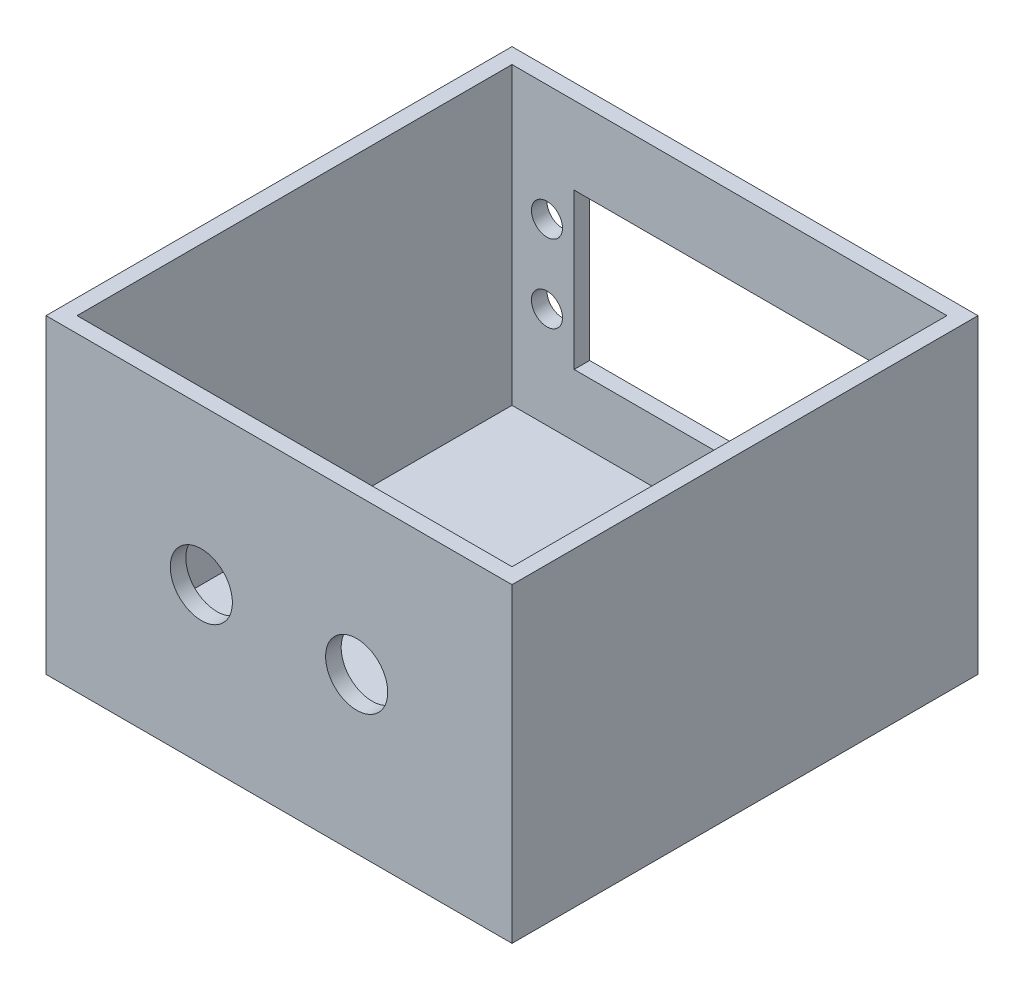
ISO-10303-21;
HEADER;
FILE_DESCRIPTION(('STEP AP214'),'2;1');
FILE_NAME('part.step','',(''),(''),'','','');
FILE_SCHEMA(('AUTOMOTIVE_DESIGN { 1 0 10303 214 1 1 1 1 }'));
ENDSEC;
DATA;
#1=APPLICATION_CONTEXT('core data for automotive mechanical design processes');
#2=APPLICATION_PROTOCOL_DEFINITION('international standard','automotive_design',2000,#1);
#3=PRODUCT_CONTEXT('',#1,'mechanical');
#4=PRODUCT('Part','Part','',(#3));
#5=PRODUCT_RELATED_PRODUCT_CATEGORY('part','',(#4));
#6=PRODUCT_DEFINITION_FORMATION('','',#4);
#7=PRODUCT_DEFINITION_CONTEXT('part definition',#1,'design');
#8=PRODUCT_DEFINITION('design','',#6,#7);
#9=PRODUCT_DEFINITION_SHAPE('','',#8);
#10=(LENGTH_UNIT() NAMED_UNIT(*) SI_UNIT(.MILLI.,.METRE.));
#11=(NAMED_UNIT(*) PLANE_ANGLE_UNIT() SI_UNIT($,.RADIAN.));
#12=(NAMED_UNIT(*) SI_UNIT($,.STERADIAN.) SOLID_ANGLE_UNIT());
#13=UNCERTAINTY_MEASURE_WITH_UNIT(LENGTH_MEASURE(1.E-05),#10,'distance_accuracy_value','');
#14=(GEOMETRIC_REPRESENTATION_CONTEXT(3) GLOBAL_UNCERTAINTY_ASSIGNED_CONTEXT((#13)) GLOBAL_UNIT_ASSIGNED_CONTEXT((#10,
#11,#12)) REPRESENTATION_CONTEXT('',''));
#15=CARTESIAN_POINT('',(0.,0.,0.));
#16=DIRECTION('',(0.,0.,1.));
#17=DIRECTION('',(1.,0.,0.));
#18=AXIS2_PLACEMENT_3D('',#15,#16,#17);
#19=CARTESIAN_POINT('',(0.,40.,60.));
#20=DIRECTION('',(0.,-1.,0.));
#21=DIRECTION('',(1.,0.,0.));
#22=AXIS2_PLACEMENT_3D('',#19,#20,#21);
#23=PLANE('',#22);
#24=DIRECTION('',(-1.,0.,0.));
#25=VECTOR('',#24,1.);
#26=CARTESIAN_POINT('',(0.,40.,0.));
#27=LINE('',#26,#25);
#28=CARTESIAN_POINT('',(60.,40.,0.));
#29=VERTEX_POINT('',#28);
#30=CARTESIAN_POINT('',(0.,40.,0.));
#31=VERTEX_POINT('',#30);
#32=EDGE_CURVE('E191',#29,#31,#27,.T.);
#33=ORIENTED_EDGE('',*,*,#32,.T.);
#34=DIRECTION('',(0.,0.,-1.));
#35=VECTOR('',#34,1.);
#36=CARTESIAN_POINT('',(0.,40.,60.));
#37=LINE('',#36,#35);
#38=CARTESIAN_POINT('',(0.,40.,60.));
#39=VERTEX_POINT('',#38);
#40=EDGE_CURVE('E197',#39,#31,#37,.T.);
#41=ORIENTED_EDGE('',*,*,#40,.F.);
#42=DIRECTION('',(-1.,0.,0.));
#43=VECTOR('',#42,1.);
#44=CARTESIAN_POINT('',(0.,40.,60.));
#45=LINE('',#44,#43);
#46=CARTESIAN_POINT('',(60.,40.,60.));
#47=VERTEX_POINT('',#46);
#48=EDGE_CURVE('E195',#47,#39,#45,.T.);
#49=ORIENTED_EDGE('',*,*,#48,.F.);
#50=DIRECTION('',(0.,0.,-1.));
#51=VECTOR('',#50,1.);
#52=CARTESIAN_POINT('',(60.,40.,60.));
#53=LINE('',#52,#51);
#54=EDGE_CURVE('E207',#47,#29,#53,.T.);
#55=ORIENTED_EDGE('',*,*,#54,.T.);
#56=EDGE_LOOP('',(#33,#41,#49,#55));
#57=FACE_BOUND('',#56,.T.);
#58=DIRECTION('',(-1.,0.,0.));
#59=VECTOR('',#58,1.);
#60=CARTESIAN_POINT('',(0.,40.,2.));
#61=LINE('',#60,#59);
#62=CARTESIAN_POINT('',(58.,40.,2.));
#63=VERTEX_POINT('',#62);
#64=CARTESIAN_POINT('',(2.,40.,2.));
#65=VERTEX_POINT('',#64);
#66=EDGE_CURVE('E167',#63,#65,#61,.T.);
#67=ORIENTED_EDGE('',*,*,#66,.F.);
#68=DIRECTION('',(0.,0.,-1.));
#69=VECTOR('',#68,1.);
#70=CARTESIAN_POINT('',(58.,40.,60.));
#71=LINE('',#70,#69);
#72=CARTESIAN_POINT('',(58.,40.,58.));
#73=VERTEX_POINT('',#72);
#74=EDGE_CURVE('E172',#73,#63,#71,.T.);
#75=ORIENTED_EDGE('',*,*,#74,.F.);
#76=DIRECTION('',(-1.,0.,0.));
#77=VECTOR('',#76,1.);
#78=CARTESIAN_POINT('',(0.,40.,58.));
#79=LINE('',#78,#77);
#80=CARTESIAN_POINT('',(2.,40.,58.));
#81=VERTEX_POINT('',#80);
#82=EDGE_CURVE('E178',#73,#81,#79,.T.);
#83=ORIENTED_EDGE('',*,*,#82,.T.);
#84=DIRECTION('',(0.,0.,-1.));
#85=VECTOR('',#84,1.);
#86=CARTESIAN_POINT('',(2.,40.,60.));
#87=LINE('',#86,#85);
#88=EDGE_CURVE('E179',#81,#65,#87,.T.);
#89=ORIENTED_EDGE('',*,*,#88,.T.);
#90=EDGE_LOOP('',(#67,#75,#83,#89));
#91=FACE_BOUND('',#90,.T.);
#92=ADVANCED_FACE('F35',(#57,#91),#23,.F.);
#93=CARTESIAN_POINT('',(0.,0.,60.));
#94=DIRECTION('',(1.,0.,0.));
#95=DIRECTION('',(0.,0.,-1.));
#96=AXIS2_PLACEMENT_3D('',#93,#94,#95);
#97=PLANE('',#96);
#98=DIRECTION('',(0.,-1.,0.));
#99=VECTOR('',#98,1.);
#100=CARTESIAN_POINT('',(0.,0.,0.));
#101=LINE('',#100,#99);
#102=CARTESIAN_POINT('',(0.,0.,0.));
#103=VERTEX_POINT('',#102);
#104=EDGE_CURVE('E161',#31,#103,#101,.T.);
#105=ORIENTED_EDGE('',*,*,#104,.T.);
#106=DIRECTION('',(0.,0.,-1.));
#107=VECTOR('',#106,1.);
#108=CARTESIAN_POINT('',(0.,0.,60.));
#109=LINE('',#108,#107);
#110=CARTESIAN_POINT('',(0.,0.,60.));
#111=VERTEX_POINT('',#110);
#112=EDGE_CURVE('E11',#111,#103,#109,.T.);
#113=ORIENTED_EDGE('',*,*,#112,.F.);
#114=DIRECTION('',(0.,-1.,0.));
#115=VECTOR('',#114,1.);
#116=CARTESIAN_POINT('',(0.,0.,60.));
#117=LINE('',#116,#115);
#118=EDGE_CURVE('E187',#39,#111,#117,.T.);
#119=ORIENTED_EDGE('',*,*,#118,.F.);
#120=ORIENTED_EDGE('',*,*,#40,.T.);
#121=EDGE_LOOP('',(#105,#113,#119,#120));
#122=FACE_BOUND('',#121,.T.);
#123=ADVANCED_FACE('F37',(#122),#97,.F.);
#124=CARTESIAN_POINT('',(0.,0.,60.));
#125=DIRECTION('',(0.,1.,0.));
#126=DIRECTION('',(0.,0.,1.));
#127=AXIS2_PLACEMENT_3D('',#124,#125,#126);
#128=PLANE('',#127);
#129=CARTESIAN_POINT('',(22.,0.,30.));
#130=DIRECTION('',(0.,-1.,0.));
#131=DIRECTION('',(0.,0.,1.));
#132=AXIS2_PLACEMENT_3D('',#129,#130,#131);
#133=CIRCLE('',#132,2.);
#134=CARTESIAN_POINT('',(22.,0.,32.));
#135=VERTEX_POINT('',#134);
#136=EDGE_CURVE('E349',#135,#135,#133,.T.);
#137=ORIENTED_EDGE('',*,*,#136,.F.);
#138=EDGE_LOOP('',(#137));
#139=FACE_BOUND('',#138,.T.);
#140=CARTESIAN_POINT('',(30.,0.,38.));
#141=DIRECTION('',(0.,-1.,0.));
#142=DIRECTION('',(0.,0.,-1.));
#143=AXIS2_PLACEMENT_3D('',#140,#141,#142);
#144=CIRCLE('',#143,2.00000000000001);
#145=CARTESIAN_POINT('',(30.,0.,36.));
#146=VERTEX_POINT('',#145);
#147=EDGE_CURVE('E342',#146,#146,#144,.T.);
#148=ORIENTED_EDGE('',*,*,#147,.F.);
#149=EDGE_LOOP('',(#148));
#150=FACE_BOUND('',#149,.T.);
#151=CARTESIAN_POINT('',(38.,0.,30.));
#152=DIRECTION('',(0.,-1.,0.));
#153=DIRECTION('',(0.,0.,-1.));
#154=AXIS2_PLACEMENT_3D('',#151,#152,#153);
#155=CIRCLE('',#154,2.);
#156=CARTESIAN_POINT('',(38.,0.,28.));
#157=VERTEX_POINT('',#156);
#158=EDGE_CURVE('E361',#157,#157,#155,.T.);
#159=ORIENTED_EDGE('',*,*,#158,.F.);
#160=EDGE_LOOP('',(#159));
#161=FACE_BOUND('',#160,.T.);
#162=CARTESIAN_POINT('',(30.,0.,22.));
#163=DIRECTION('',(0.,-1.,0.));
#164=DIRECTION('',(0.,0.,1.));
#165=AXIS2_PLACEMENT_3D('',#162,#163,#164);
#166=CIRCLE('',#165,2.00000000000001);
#167=CARTESIAN_POINT('',(30.,0.,24.));
#168=VERTEX_POINT('',#167);
#169=EDGE_CURVE('E354',#168,#168,#166,.T.);
#170=ORIENTED_EDGE('',*,*,#169,.F.);
#171=EDGE_LOOP('',(#170));
#172=FACE_BOUND('',#171,.T.);
#173=CARTESIAN_POINT('',(30.,0.,30.));
#174=DIRECTION('',(0.,-1.,0.));
#175=DIRECTION('',(0.,0.,-1.));
#176=AXIS2_PLACEMENT_3D('',#173,#174,#175);
#177=CIRCLE('',#176,2.);
#178=CARTESIAN_POINT('',(30.,0.,28.));
#179=VERTEX_POINT('',#178);
#180=EDGE_CURVE('E366',#179,#179,#177,.T.);
#181=ORIENTED_EDGE('',*,*,#180,.F.);
#182=EDGE_LOOP('',(#181));
#183=FACE_BOUND('',#182,.T.);
#184=DIRECTION('',(1.,0.,0.));
#185=VECTOR('',#184,1.);
#186=CARTESIAN_POINT('',(0.,0.,0.));
#187=LINE('',#186,#185);
#188=CARTESIAN_POINT('',(60.,0.,0.));
#189=VERTEX_POINT('',#188);
#190=EDGE_CURVE('E200',#103,#189,#187,.T.);
#191=ORIENTED_EDGE('',*,*,#190,.T.);
#192=DIRECTION('',(0.,0.,-1.));
#193=VECTOR('',#192,1.);
#194=CARTESIAN_POINT('',(60.,0.,60.));
#195=LINE('',#194,#193);
#196=CARTESIAN_POINT('',(60.,0.,60.));
#197=VERTEX_POINT('',#196);
#198=EDGE_CURVE('E43',#197,#189,#195,.T.);
#199=ORIENTED_EDGE('',*,*,#198,.F.);
#200=DIRECTION('',(1.,0.,0.));
#201=VECTOR('',#200,1.);
#202=CARTESIAN_POINT('',(0.,0.,60.));
#203=LINE('',#202,#201);
#204=EDGE_CURVE('E190',#111,#197,#203,.T.);
#205=ORIENTED_EDGE('',*,*,#204,.F.);
#206=ORIENTED_EDGE('',*,*,#112,.T.);
#207=EDGE_LOOP('',(#191,#199,#205,#206));
#208=FACE_BOUND('',#207,.T.);
#209=ADVANCED_FACE('F228',(#139,#150,#161,#172,#183,#208),#128,.F.);
#210=CARTESIAN_POINT('',(60.,0.,60.));
#211=DIRECTION('',(-1.,0.,0.));
#212=DIRECTION('',(0.,0.,1.));
#213=AXIS2_PLACEMENT_3D('',#210,#211,#212);
#214=PLANE('',#213);
#215=DIRECTION('',(0.,1.,0.));
#216=VECTOR('',#215,1.);
#217=CARTESIAN_POINT('',(60.,0.,0.));
#218=LINE('',#217,#216);
#219=EDGE_CURVE('E202',#189,#29,#218,.T.);
#220=ORIENTED_EDGE('',*,*,#219,.T.);
#221=ORIENTED_EDGE('',*,*,#54,.F.);
#222=DIRECTION('',(0.,1.,0.));
#223=VECTOR('',#222,1.);
#224=CARTESIAN_POINT('',(60.,0.,60.));
#225=LINE('',#224,#223);
#226=EDGE_CURVE('E193',#197,#47,#225,.T.);
#227=ORIENTED_EDGE('',*,*,#226,.F.);
#228=ORIENTED_EDGE('',*,*,#198,.T.);
#229=EDGE_LOOP('',(#220,#221,#227,#228));
#230=FACE_BOUND('',#229,.T.);
#231=ADVANCED_FACE('F214',(#230),#214,.F.);
#232=CARTESIAN_POINT('',(0.,0.,60.));
#233=DIRECTION('',(0.,0.,-1.));
#234=DIRECTION('',(-1.,0.,0.));
#235=AXIS2_PLACEMENT_3D('',#232,#233,#234);
#236=PLANE('',#235);
#237=CARTESIAN_POINT('',(40.,20.,60.));
#238=DIRECTION('',(0.,0.,-1.));
#239=DIRECTION('',(-1.,0.,0.));
#240=AXIS2_PLACEMENT_3D('',#237,#238,#239);
#241=CIRCLE('',#240,3.99999999999999);
#242=CARTESIAN_POINT('',(36.,20.,60.));
#243=VERTEX_POINT('',#242);
#244=EDGE_CURVE('E331',#243,#243,#241,.T.);
#245=ORIENTED_EDGE('',*,*,#244,.T.);
#246=EDGE_LOOP('',(#245));
#247=FACE_BOUND('',#246,.T.);
#248=CARTESIAN_POINT('',(20.,20.,60.));
#249=DIRECTION('',(0.,0.,1.));
#250=DIRECTION('',(1.,0.,0.));
#251=AXIS2_PLACEMENT_3D('',#248,#249,#250);
#252=CIRCLE('',#251,4.);
#253=CARTESIAN_POINT('',(24.,20.,60.));
#254=VERTEX_POINT('',#253);
#255=EDGE_CURVE('E335',#254,#254,#252,.T.);
#256=ORIENTED_EDGE('',*,*,#255,.F.);
#257=EDGE_LOOP('',(#256));
#258=FACE_BOUND('',#257,.T.);
#259=ORIENTED_EDGE('',*,*,#118,.T.);
#260=ORIENTED_EDGE('',*,*,#204,.T.);
#261=ORIENTED_EDGE('',*,*,#226,.T.);
#262=ORIENTED_EDGE('',*,*,#48,.T.);
#263=EDGE_LOOP('',(#259,#260,#261,#262));
#264=FACE_BOUND('',#263,.T.);
#265=ADVANCED_FACE('F227',(#247,#258,#264),#236,.F.);
#266=CARTESIAN_POINT('',(0.,0.,0.));
#267=DIRECTION('',(0.,0.,-1.));
#268=DIRECTION('',(-1.,0.,0.));
#269=AXIS2_PLACEMENT_3D('',#266,#267,#268);
#270=PLANE('',#269);
#271=CARTESIAN_POINT('',(53.5,25.,0.));
#272=DIRECTION('',(0.,0.,-1.));
#273=DIRECTION('',(-1.,0.,0.));
#274=AXIS2_PLACEMENT_3D('',#271,#272,#273);
#275=CIRCLE('',#274,2.);
#276=CARTESIAN_POINT('',(51.5,25.,0.));
#277=VERTEX_POINT('',#276);
#278=EDGE_CURVE('E372',#277,#277,#275,.T.);
#279=ORIENTED_EDGE('',*,*,#278,.F.);
#280=EDGE_LOOP('',(#279));
#281=FACE_BOUND('',#280,.T.);
#282=CARTESIAN_POINT('',(53.5,15.,0.));
#283=DIRECTION('',(0.,0.,-1.));
#284=DIRECTION('',(1.,0.,0.));
#285=AXIS2_PLACEMENT_3D('',#282,#283,#284);
#286=CIRCLE('',#285,2.);
#287=CARTESIAN_POINT('',(55.5,15.,0.));
#288=VERTEX_POINT('',#287);
#289=EDGE_CURVE('E380',#288,#288,#286,.T.);
#290=ORIENTED_EDGE('',*,*,#289,.F.);
#291=EDGE_LOOP('',(#290));
#292=FACE_BOUND('',#291,.T.);
#293=CARTESIAN_POINT('',(6.5,15.,0.));
#294=DIRECTION('',(0.,0.,-1.));
#295=DIRECTION('',(-1.,0.,0.));
#296=AXIS2_PLACEMENT_3D('',#293,#294,#295);
#297=CIRCLE('',#296,2.);
#298=CARTESIAN_POINT('',(4.5,15.,0.));
#299=VERTEX_POINT('',#298);
#300=EDGE_CURVE('E386',#299,#299,#297,.T.);
#301=ORIENTED_EDGE('',*,*,#300,.F.);
#302=EDGE_LOOP('',(#301));
#303=FACE_BOUND('',#302,.T.);
#304=CARTESIAN_POINT('',(6.5,25.,0.));
#305=DIRECTION('',(0.,0.,-1.));
#306=DIRECTION('',(1.,0.,0.));
#307=AXIS2_PLACEMENT_3D('',#304,#305,#306);
#308=CIRCLE('',#307,2.);
#309=CARTESIAN_POINT('',(8.5,25.,0.));
#310=VERTEX_POINT('',#309);
#311=EDGE_CURVE('E369',#310,#310,#308,.T.);
#312=ORIENTED_EDGE('',*,*,#311,.F.);
#313=EDGE_LOOP('',(#312));
#314=FACE_BOUND('',#313,.T.);
#315=DIRECTION('',(-1.,0.,0.));
#316=VECTOR('',#315,1.);
#317=CARTESIAN_POINT('',(50.,10.,0.));
#318=LINE('',#317,#316);
#319=CARTESIAN_POINT('',(50.,10.,0.));
#320=VERTEX_POINT('',#319);
#321=CARTESIAN_POINT('',(10.,10.,0.));
#322=VERTEX_POINT('',#321);
#323=EDGE_CURVE('E126',#320,#322,#318,.T.);
#324=ORIENTED_EDGE('',*,*,#323,.F.);
#325=DIRECTION('',(0.,-1.,0.));
#326=VECTOR('',#325,1.);
#327=CARTESIAN_POINT('',(50.,30.,0.));
#328=LINE('',#327,#326);
#329=CARTESIAN_POINT('',(50.,30.,0.));
#330=VERTEX_POINT('',#329);
#331=EDGE_CURVE('E134',#330,#320,#328,.T.);
#332=ORIENTED_EDGE('',*,*,#331,.F.);
#333=DIRECTION('',(1.,0.,0.));
#334=VECTOR('',#333,1.);
#335=CARTESIAN_POINT('',(50.,30.,0.));
#336=LINE('',#335,#334);
#337=CARTESIAN_POINT('',(10.,30.,0.));
#338=VERTEX_POINT('',#337);
#339=EDGE_CURVE('E50',#338,#330,#336,.T.);
#340=ORIENTED_EDGE('',*,*,#339,.F.);
#341=DIRECTION('',(0.,1.,0.));
#342=VECTOR('',#341,1.);
#343=CARTESIAN_POINT('',(10.,30.,0.));
#344=LINE('',#343,#342);
#345=EDGE_CURVE('E143',#322,#338,#344,.T.);
#346=ORIENTED_EDGE('',*,*,#345,.F.);
#347=EDGE_LOOP('',(#324,#332,#340,#346));
#348=FACE_BOUND('',#347,.T.);
#349=ORIENTED_EDGE('',*,*,#104,.F.);
#350=ORIENTED_EDGE('',*,*,#32,.F.);
#351=ORIENTED_EDGE('',*,*,#219,.F.);
#352=ORIENTED_EDGE('',*,*,#190,.F.);
#353=EDGE_LOOP('',(#349,#350,#351,#352));
#354=FACE_BOUND('',#353,.T.);
#355=ADVANCED_FACE('F140',(#281,#292,#303,#314,#348,#354),#270,.T.);
#356=CARTESIAN_POINT('',(2.,0.,60.));
#357=DIRECTION('',(1.,0.,0.));
#358=DIRECTION('',(0.,0.,-1.));
#359=AXIS2_PLACEMENT_3D('',#356,#357,#358);
#360=PLANE('',#359);
#361=DIRECTION('',(0.,-1.,0.));
#362=VECTOR('',#361,1.);
#363=CARTESIAN_POINT('',(2.,0.,2.));
#364=LINE('',#363,#362);
#365=CARTESIAN_POINT('',(2.,2.,2.));
#366=VERTEX_POINT('',#365);
#367=EDGE_CURVE('E154',#65,#366,#364,.T.);
#368=ORIENTED_EDGE('',*,*,#367,.F.);
#369=ORIENTED_EDGE('',*,*,#88,.F.);
#370=DIRECTION('',(0.,-1.,0.));
#371=VECTOR('',#370,1.);
#372=CARTESIAN_POINT('',(2.,0.,58.));
#373=LINE('',#372,#371);
#374=CARTESIAN_POINT('',(2.,2.,58.));
#375=VERTEX_POINT('',#374);
#376=EDGE_CURVE('E163',#81,#375,#373,.T.);
#377=ORIENTED_EDGE('',*,*,#376,.T.);
#378=DIRECTION('',(0.,0.,-1.));
#379=VECTOR('',#378,1.);
#380=CARTESIAN_POINT('',(2.,2.,60.));
#381=LINE('',#380,#379);
#382=EDGE_CURVE('E158',#375,#366,#381,.T.);
#383=ORIENTED_EDGE('',*,*,#382,.T.);
#384=EDGE_LOOP('',(#368,#369,#377,#383));
#385=FACE_BOUND('',#384,.T.);
#386=ADVANCED_FACE('F245',(#385),#360,.T.);
#387=CARTESIAN_POINT('',(0.,2.,60.));
#388=DIRECTION('',(0.,1.,0.));
#389=DIRECTION('',(0.,0.,1.));
#390=AXIS2_PLACEMENT_3D('',#387,#388,#389);
#391=PLANE('',#390);
#392=CARTESIAN_POINT('',(22.,2.,30.));
#393=DIRECTION('',(0.,1.,0.));
#394=DIRECTION('',(0.,0.,1.));
#395=AXIS2_PLACEMENT_3D('',#392,#393,#394);
#396=CIRCLE('',#395,2.);
#397=CARTESIAN_POINT('',(22.,2.,32.));
#398=VERTEX_POINT('',#397);
#399=EDGE_CURVE('E340',#398,#398,#396,.F.);
#400=ORIENTED_EDGE('',*,*,#399,.T.);
#401=EDGE_LOOP('',(#400));
#402=FACE_BOUND('',#401,.T.);
#403=CARTESIAN_POINT('',(30.,2.,38.));
#404=DIRECTION('',(0.,1.,0.));
#405=DIRECTION('',(0.,0.,1.));
#406=AXIS2_PLACEMENT_3D('',#403,#404,#405);
#407=CIRCLE('',#406,2.00000000000001);
#408=CARTESIAN_POINT('',(30.,2.,40.));
#409=VERTEX_POINT('',#408);
#410=EDGE_CURVE('E346',#409,#409,#407,.F.);
#411=ORIENTED_EDGE('',*,*,#410,.T.);
#412=EDGE_LOOP('',(#411));
#413=FACE_BOUND('',#412,.T.);
#414=CARTESIAN_POINT('',(38.,2.,30.));
#415=DIRECTION('',(0.,1.,0.));
#416=DIRECTION('',(0.,0.,1.));
#417=AXIS2_PLACEMENT_3D('',#414,#415,#416);
#418=CIRCLE('',#417,2.);
#419=CARTESIAN_POINT('',(38.,2.,32.));
#420=VERTEX_POINT('',#419);
#421=EDGE_CURVE('E345',#420,#420,#418,.F.);
#422=ORIENTED_EDGE('',*,*,#421,.T.);
#423=EDGE_LOOP('',(#422));
#424=FACE_BOUND('',#423,.T.);
#425=CARTESIAN_POINT('',(30.,2.,22.));
#426=DIRECTION('',(0.,1.,0.));
#427=DIRECTION('',(0.,0.,1.));
#428=AXIS2_PLACEMENT_3D('',#425,#426,#427);
#429=CIRCLE('',#428,2.00000000000001);
#430=CARTESIAN_POINT('',(30.,2.,24.));
#431=VERTEX_POINT('',#430);
#432=EDGE_CURVE('E358',#431,#431,#429,.F.);
#433=ORIENTED_EDGE('',*,*,#432,.T.);
#434=EDGE_LOOP('',(#433));
#435=FACE_BOUND('',#434,.T.);
#436=CARTESIAN_POINT('',(30.,2.,30.));
#437=DIRECTION('',(0.,1.,0.));
#438=DIRECTION('',(0.,0.,1.));
#439=AXIS2_PLACEMENT_3D('',#436,#437,#438);
#440=CIRCLE('',#439,2.);
#441=CARTESIAN_POINT('',(30.,2.,32.));
#442=VERTEX_POINT('',#441);
#443=EDGE_CURVE('E357',#442,#442,#440,.F.);
#444=ORIENTED_EDGE('',*,*,#443,.T.);
#445=EDGE_LOOP('',(#444));
#446=FACE_BOUND('',#445,.T.);
#447=DIRECTION('',(1.,0.,0.));
#448=VECTOR('',#447,1.);
#449=CARTESIAN_POINT('',(0.,2.,2.));
#450=LINE('',#449,#448);
#451=CARTESIAN_POINT('',(58.,2.,2.));
#452=VERTEX_POINT('',#451);
#453=EDGE_CURVE('E157',#366,#452,#450,.T.);
#454=ORIENTED_EDGE('',*,*,#453,.F.);
#455=ORIENTED_EDGE('',*,*,#382,.F.);
#456=DIRECTION('',(1.,0.,0.));
#457=VECTOR('',#456,1.);
#458=CARTESIAN_POINT('',(0.,2.,58.));
#459=LINE('',#458,#457);
#460=CARTESIAN_POINT('',(58.,2.,58.));
#461=VERTEX_POINT('',#460);
#462=EDGE_CURVE('E166',#375,#461,#459,.T.);
#463=ORIENTED_EDGE('',*,*,#462,.T.);
#464=DIRECTION('',(0.,0.,-1.));
#465=VECTOR('',#464,1.);
#466=CARTESIAN_POINT('',(58.,2.,60.));
#467=LINE('',#466,#465);
#468=EDGE_CURVE('E162',#461,#452,#467,.T.);
#469=ORIENTED_EDGE('',*,*,#468,.T.);
#470=EDGE_LOOP('',(#454,#455,#463,#469));
#471=FACE_BOUND('',#470,.T.);
#472=ADVANCED_FACE('F261',(#402,#413,#424,#435,#446,#471),#391,.T.);
#473=CARTESIAN_POINT('',(58.,0.,60.));
#474=DIRECTION('',(-1.,0.,0.));
#475=DIRECTION('',(0.,0.,1.));
#476=AXIS2_PLACEMENT_3D('',#473,#474,#475);
#477=PLANE('',#476);
#478=DIRECTION('',(0.,1.,0.));
#479=VECTOR('',#478,1.);
#480=CARTESIAN_POINT('',(58.,0.,2.));
#481=LINE('',#480,#479);
#482=EDGE_CURVE('E169',#452,#63,#481,.T.);
#483=ORIENTED_EDGE('',*,*,#482,.F.);
#484=ORIENTED_EDGE('',*,*,#468,.F.);
#485=DIRECTION('',(0.,1.,0.));
#486=VECTOR('',#485,1.);
#487=CARTESIAN_POINT('',(58.,0.,58.));
#488=LINE('',#487,#486);
#489=EDGE_CURVE('E174',#461,#73,#488,.T.);
#490=ORIENTED_EDGE('',*,*,#489,.T.);
#491=ORIENTED_EDGE('',*,*,#74,.T.);
#492=EDGE_LOOP('',(#483,#484,#490,#491));
#493=FACE_BOUND('',#492,.T.);
#494=ADVANCED_FACE('F257',(#493),#477,.T.);
#495=CARTESIAN_POINT('',(0.,0.,58.));
#496=DIRECTION('',(0.,0.,-1.));
#497=DIRECTION('',(-1.,0.,0.));
#498=AXIS2_PLACEMENT_3D('',#495,#496,#497);
#499=PLANE('',#498);
#500=CARTESIAN_POINT('',(40.,20.,58.));
#501=DIRECTION('',(0.,0.,-1.));
#502=DIRECTION('',(-1.,0.,0.));
#503=AXIS2_PLACEMENT_3D('',#500,#501,#502);
#504=CIRCLE('',#503,3.99999999999999);
#505=CARTESIAN_POINT('',(36.,20.,58.));
#506=VERTEX_POINT('',#505);
#507=EDGE_CURVE('E328',#506,#506,#504,.T.);
#508=ORIENTED_EDGE('',*,*,#507,.F.);
#509=EDGE_LOOP('',(#508));
#510=FACE_BOUND('',#509,.T.);
#511=CARTESIAN_POINT('',(20.,20.,58.));
#512=DIRECTION('',(0.,0.,-1.));
#513=DIRECTION('',(-1.,0.,0.));
#514=AXIS2_PLACEMENT_3D('',#511,#512,#513);
#515=CIRCLE('',#514,4.);
#516=CARTESIAN_POINT('',(16.,20.,58.));
#517=VERTEX_POINT('',#516);
#518=EDGE_CURVE('E332',#517,#517,#515,.F.);
#519=ORIENTED_EDGE('',*,*,#518,.T.);
#520=EDGE_LOOP('',(#519));
#521=FACE_BOUND('',#520,.T.);
#522=ORIENTED_EDGE('',*,*,#376,.F.);
#523=ORIENTED_EDGE('',*,*,#82,.F.);
#524=ORIENTED_EDGE('',*,*,#489,.F.);
#525=ORIENTED_EDGE('',*,*,#462,.F.);
#526=EDGE_LOOP('',(#522,#523,#524,#525));
#527=FACE_BOUND('',#526,.T.);
#528=ADVANCED_FACE('F253',(#510,#521,#527),#499,.T.);
#529=CARTESIAN_POINT('',(0.,0.,2.));
#530=DIRECTION('',(0.,0.,-1.));
#531=DIRECTION('',(-1.,0.,0.));
#532=AXIS2_PLACEMENT_3D('',#529,#530,#531);
#533=PLANE('',#532);
#534=CARTESIAN_POINT('',(53.5,25.,2.));
#535=DIRECTION('',(0.,0.,-1.));
#536=DIRECTION('',(-1.,0.,0.));
#537=AXIS2_PLACEMENT_3D('',#534,#535,#536);
#538=CIRCLE('',#537,2.);
#539=CARTESIAN_POINT('',(51.5,25.,2.));
#540=VERTEX_POINT('',#539);
#541=EDGE_CURVE('E375',#540,#540,#538,.F.);
#542=ORIENTED_EDGE('',*,*,#541,.F.);
#543=EDGE_LOOP('',(#542));
#544=FACE_BOUND('',#543,.T.);
#545=CARTESIAN_POINT('',(53.5,15.,2.));
#546=DIRECTION('',(0.,0.,-1.));
#547=DIRECTION('',(-1.,0.,0.));
#548=AXIS2_PLACEMENT_3D('',#545,#546,#547);
#549=CIRCLE('',#548,2.);
#550=CARTESIAN_POINT('',(51.5,15.,2.));
#551=VERTEX_POINT('',#550);
#552=EDGE_CURVE('E376',#551,#551,#549,.F.);
#553=ORIENTED_EDGE('',*,*,#552,.F.);
#554=EDGE_LOOP('',(#553));
#555=FACE_BOUND('',#554,.T.);
#556=CARTESIAN_POINT('',(6.5,15.,2.));
#557=DIRECTION('',(0.,0.,-1.));
#558=DIRECTION('',(-1.,0.,0.));
#559=AXIS2_PLACEMENT_3D('',#556,#557,#558);
#560=CIRCLE('',#559,2.);
#561=CARTESIAN_POINT('',(4.5,15.,2.));
#562=VERTEX_POINT('',#561);
#563=EDGE_CURVE('E383',#562,#562,#560,.F.);
#564=ORIENTED_EDGE('',*,*,#563,.F.);
#565=EDGE_LOOP('',(#564));
#566=FACE_BOUND('',#565,.T.);
#567=CARTESIAN_POINT('',(6.5,25.,2.));
#568=DIRECTION('',(0.,0.,-1.));
#569=DIRECTION('',(-1.,0.,0.));
#570=AXIS2_PLACEMENT_3D('',#567,#568,#569);
#571=CIRCLE('',#570,2.);
#572=CARTESIAN_POINT('',(4.5,25.,2.));
#573=VERTEX_POINT('',#572);
#574=EDGE_CURVE('E389',#573,#573,#571,.F.);
#575=ORIENTED_EDGE('',*,*,#574,.F.);
#576=EDGE_LOOP('',(#575));
#577=FACE_BOUND('',#576,.T.);
#578=DIRECTION('',(0.,1.,0.));
#579=VECTOR('',#578,1.);
#580=CARTESIAN_POINT('',(50.,30.,2.));
#581=LINE('',#580,#579);
#582=CARTESIAN_POINT('',(50.,10.,2.));
#583=VERTEX_POINT('',#582);
#584=CARTESIAN_POINT('',(50.,30.,2.));
#585=VERTEX_POINT('',#584);
#586=EDGE_CURVE('E138',#583,#585,#581,.T.);
#587=ORIENTED_EDGE('',*,*,#586,.F.);
#588=DIRECTION('',(1.,0.,0.));
#589=VECTOR('',#588,1.);
#590=CARTESIAN_POINT('',(50.,10.,2.));
#591=LINE('',#590,#589);
#592=CARTESIAN_POINT('',(10.,10.,2.));
#593=VERTEX_POINT('',#592);
#594=EDGE_CURVE('E58',#593,#583,#591,.T.);
#595=ORIENTED_EDGE('',*,*,#594,.F.);
#596=DIRECTION('',(0.,-1.,0.));
#597=VECTOR('',#596,1.);
#598=CARTESIAN_POINT('',(10.,30.,2.));
#599=LINE('',#598,#597);
#600=CARTESIAN_POINT('',(10.,30.,2.));
#601=VERTEX_POINT('',#600);
#602=EDGE_CURVE('E379',#601,#593,#599,.T.);
#603=ORIENTED_EDGE('',*,*,#602,.F.);
#604=DIRECTION('',(-1.,0.,0.));
#605=VECTOR('',#604,1.);
#606=CARTESIAN_POINT('',(50.,30.,2.));
#607=LINE('',#606,#605);
#608=EDGE_CURVE('E398',#585,#601,#607,.T.);
#609=ORIENTED_EDGE('',*,*,#608,.F.);
#610=EDGE_LOOP('',(#587,#595,#603,#609));
#611=FACE_BOUND('',#610,.T.);
#612=ORIENTED_EDGE('',*,*,#367,.T.);
#613=ORIENTED_EDGE('',*,*,#453,.T.);
#614=ORIENTED_EDGE('',*,*,#482,.T.);
#615=ORIENTED_EDGE('',*,*,#66,.T.);
#616=EDGE_LOOP('',(#612,#613,#614,#615));
#617=FACE_BOUND('',#616,.T.);
#618=ADVANCED_FACE('F250',(#544,#555,#566,#577,#611,#617),#533,.F.);
#619=CARTESIAN_POINT('',(50.,10.,60.001));
#620=DIRECTION('',(0.,-1.,0.));
#621=DIRECTION('',(1.,0.,0.));
#622=AXIS2_PLACEMENT_3D('',#619,#620,#621);
#623=PLANE('',#622);
#624=ORIENTED_EDGE('',*,*,#594,.T.);
#625=DIRECTION('',(0.,0.,-1.));
#626=VECTOR('',#625,1.);
#627=CARTESIAN_POINT('',(50.,10.,60.001));
#628=LINE('',#627,#626);
#629=EDGE_CURVE('E122',#583,#320,#628,.T.);
#630=ORIENTED_EDGE('',*,*,#629,.T.);
#631=ORIENTED_EDGE('',*,*,#323,.T.);
#632=DIRECTION('',(0.,0.,-1.));
#633=VECTOR('',#632,1.);
#634=CARTESIAN_POINT('',(10.,10.,60.001));
#635=LINE('',#634,#633);
#636=EDGE_CURVE('E131',#593,#322,#635,.T.);
#637=ORIENTED_EDGE('',*,*,#636,.F.);
#638=EDGE_LOOP('',(#624,#630,#631,#637));
#639=FACE_BOUND('',#638,.T.);
#640=ADVANCED_FACE('F124',(#639),#623,.F.);
#641=CARTESIAN_POINT('',(10.,30.,60.001));
#642=DIRECTION('',(-1.,0.,0.));
#643=DIRECTION('',(0.,-1.,0.));
#644=AXIS2_PLACEMENT_3D('',#641,#642,#643);
#645=PLANE('',#644);
#646=ORIENTED_EDGE('',*,*,#602,.T.);
#647=ORIENTED_EDGE('',*,*,#636,.T.);
#648=ORIENTED_EDGE('',*,*,#345,.T.);
#649=DIRECTION('',(0.,0.,-1.));
#650=VECTOR('',#649,1.);
#651=CARTESIAN_POINT('',(10.,30.,60.001));
#652=LINE('',#651,#650);
#653=EDGE_CURVE('E150',#601,#338,#652,.T.);
#654=ORIENTED_EDGE('',*,*,#653,.F.);
#655=EDGE_LOOP('',(#646,#647,#648,#654));
#656=FACE_BOUND('',#655,.T.);
#657=ADVANCED_FACE('F275',(#656),#645,.F.);
#658=CARTESIAN_POINT('',(50.,30.,60.001));
#659=DIRECTION('',(0.,1.,0.));
#660=DIRECTION('',(0.,0.,1.));
#661=AXIS2_PLACEMENT_3D('',#658,#659,#660);
#662=PLANE('',#661);
#663=ORIENTED_EDGE('',*,*,#608,.T.);
#664=ORIENTED_EDGE('',*,*,#653,.T.);
#665=ORIENTED_EDGE('',*,*,#339,.T.);
#666=DIRECTION('',(0.,0.,-1.));
#667=VECTOR('',#666,1.);
#668=CARTESIAN_POINT('',(50.,30.,60.001));
#669=LINE('',#668,#667);
#670=EDGE_CURVE('E136',#585,#330,#669,.T.);
#671=ORIENTED_EDGE('',*,*,#670,.F.);
#672=EDGE_LOOP('',(#663,#664,#665,#671));
#673=FACE_BOUND('',#672,.T.);
#674=ADVANCED_FACE('F272',(#673),#662,.F.);
#675=CARTESIAN_POINT('',(50.,30.,60.001));
#676=DIRECTION('',(1.,0.,0.));
#677=DIRECTION('',(0.,1.,0.));
#678=AXIS2_PLACEMENT_3D('',#675,#676,#677);
#679=PLANE('',#678);
#680=ORIENTED_EDGE('',*,*,#586,.T.);
#681=ORIENTED_EDGE('',*,*,#670,.T.);
#682=ORIENTED_EDGE('',*,*,#331,.T.);
#683=ORIENTED_EDGE('',*,*,#629,.F.);
#684=EDGE_LOOP('',(#680,#681,#682,#683));
#685=FACE_BOUND('',#684,.T.);
#686=ADVANCED_FACE('F135',(#685),#679,.F.);
#687=CARTESIAN_POINT('',(6.5,25.,60.001));
#688=DIRECTION('',(0.,0.,-1.));
#689=DIRECTION('',(-1.,0.,0.));
#690=AXIS2_PLACEMENT_3D('',#687,#688,#689);
#691=CYLINDRICAL_SURFACE('',#690,2.);
#692=ORIENTED_EDGE('',*,*,#311,.T.);
#693=EDGE_LOOP('',(#692));
#694=FACE_BOUND('',#693,.T.);
#695=ORIENTED_EDGE('',*,*,#574,.T.);
#696=EDGE_LOOP('',(#695));
#697=FACE_BOUND('',#696,.T.);
#698=ADVANCED_FACE('F271',(#694,#697),#691,.F.);
#699=CARTESIAN_POINT('',(6.5,15.,60.001));
#700=DIRECTION('',(0.,0.,-1.));
#701=DIRECTION('',(-1.,0.,0.));
#702=AXIS2_PLACEMENT_3D('',#699,#700,#701);
#703=CYLINDRICAL_SURFACE('',#702,2.);
#704=ORIENTED_EDGE('',*,*,#300,.T.);
#705=EDGE_LOOP('',(#704));
#706=FACE_BOUND('',#705,.T.);
#707=ORIENTED_EDGE('',*,*,#563,.T.);
#708=EDGE_LOOP('',(#707));
#709=FACE_BOUND('',#708,.T.);
#710=ADVANCED_FACE('F283',(#706,#709),#703,.F.);
#711=CARTESIAN_POINT('',(53.5,15.,60.001));
#712=DIRECTION('',(0.,0.,-1.));
#713=DIRECTION('',(-1.,0.,0.));
#714=AXIS2_PLACEMENT_3D('',#711,#712,#713);
#715=CYLINDRICAL_SURFACE('',#714,2.);
#716=ORIENTED_EDGE('',*,*,#289,.T.);
#717=EDGE_LOOP('',(#716));
#718=FACE_BOUND('',#717,.T.);
#719=ORIENTED_EDGE('',*,*,#552,.T.);
#720=EDGE_LOOP('',(#719));
#721=FACE_BOUND('',#720,.T.);
#722=ADVANCED_FACE('F287',(#718,#721),#715,.F.);
#723=CARTESIAN_POINT('',(53.5,25.,60.001));
#724=DIRECTION('',(0.,0.,-1.));
#725=DIRECTION('',(-1.,0.,0.));
#726=AXIS2_PLACEMENT_3D('',#723,#724,#725);
#727=CYLINDRICAL_SURFACE('',#726,2.);
#728=ORIENTED_EDGE('',*,*,#278,.T.);
#729=EDGE_LOOP('',(#728));
#730=FACE_BOUND('',#729,.T.);
#731=ORIENTED_EDGE('',*,*,#541,.T.);
#732=EDGE_LOOP('',(#731));
#733=FACE_BOUND('',#732,.T.);
#734=ADVANCED_FACE('F291',(#730,#733),#727,.F.);
#735=CARTESIAN_POINT('',(30.,40.001,30.));
#736=DIRECTION('',(0.,-1.,0.));
#737=DIRECTION('',(0.,0.,-1.));
#738=AXIS2_PLACEMENT_3D('',#735,#736,#737);
#739=CYLINDRICAL_SURFACE('',#738,2.);
#740=ORIENTED_EDGE('',*,*,#443,.F.);
#741=EDGE_LOOP('',(#740));
#742=FACE_BOUND('',#741,.T.);
#743=ORIENTED_EDGE('',*,*,#180,.T.);
#744=EDGE_LOOP('',(#743));
#745=FACE_BOUND('',#744,.T.);
#746=ADVANCED_FACE('F295',(#742,#745),#739,.F.);
#747=CARTESIAN_POINT('',(30.,40.001,22.));
#748=DIRECTION('',(0.,-1.,0.));
#749=DIRECTION('',(0.,0.,-1.));
#750=AXIS2_PLACEMENT_3D('',#747,#748,#749);
#751=CYLINDRICAL_SURFACE('',#750,2.00000000000001);
#752=ORIENTED_EDGE('',*,*,#432,.F.);
#753=EDGE_LOOP('',(#752));
#754=FACE_BOUND('',#753,.T.);
#755=ORIENTED_EDGE('',*,*,#169,.T.);
#756=EDGE_LOOP('',(#755));
#757=FACE_BOUND('',#756,.T.);
#758=ADVANCED_FACE('F299',(#754,#757),#751,.F.);
#759=CARTESIAN_POINT('',(38.,40.001,30.));
#760=DIRECTION('',(0.,-1.,0.));
#761=DIRECTION('',(0.,0.,-1.));
#762=AXIS2_PLACEMENT_3D('',#759,#760,#761);
#763=CYLINDRICAL_SURFACE('',#762,2.);
#764=ORIENTED_EDGE('',*,*,#421,.F.);
#765=EDGE_LOOP('',(#764));
#766=FACE_BOUND('',#765,.T.);
#767=ORIENTED_EDGE('',*,*,#158,.T.);
#768=EDGE_LOOP('',(#767));
#769=FACE_BOUND('',#768,.T.);
#770=ADVANCED_FACE('F301',(#766,#769),#763,.F.);
#771=CARTESIAN_POINT('',(30.,40.001,38.));
#772=DIRECTION('',(0.,-1.,0.));
#773=DIRECTION('',(0.,0.,-1.));
#774=AXIS2_PLACEMENT_3D('',#771,#772,#773);
#775=CYLINDRICAL_SURFACE('',#774,2.00000000000001);
#776=ORIENTED_EDGE('',*,*,#410,.F.);
#777=EDGE_LOOP('',(#776));
#778=FACE_BOUND('',#777,.T.);
#779=ORIENTED_EDGE('',*,*,#147,.T.);
#780=EDGE_LOOP('',(#779));
#781=FACE_BOUND('',#780,.T.);
#782=ADVANCED_FACE('F304',(#778,#781),#775,.F.);
#783=CARTESIAN_POINT('',(22.,40.001,30.));
#784=DIRECTION('',(0.,-1.,0.));
#785=DIRECTION('',(0.,0.,-1.));
#786=AXIS2_PLACEMENT_3D('',#783,#784,#785);
#787=CYLINDRICAL_SURFACE('',#786,2.);
#788=ORIENTED_EDGE('',*,*,#399,.F.);
#789=EDGE_LOOP('',(#788));
#790=FACE_BOUND('',#789,.T.);
#791=ORIENTED_EDGE('',*,*,#136,.T.);
#792=EDGE_LOOP('',(#791));
#793=FACE_BOUND('',#792,.T.);
#794=ADVANCED_FACE('F309',(#790,#793),#787,.F.);
#795=CARTESIAN_POINT('',(20.,20.,-0.001000000000001));
#796=DIRECTION('',(0.,0.,1.));
#797=DIRECTION('',(1.,0.,0.));
#798=AXIS2_PLACEMENT_3D('',#795,#796,#797);
#799=CYLINDRICAL_SURFACE('',#798,4.);
#800=ORIENTED_EDGE('',*,*,#518,.F.);
#801=EDGE_LOOP('',(#800));
#802=FACE_BOUND('',#801,.T.);
#803=ORIENTED_EDGE('',*,*,#255,.T.);
#804=EDGE_LOOP('',(#803));
#805=FACE_BOUND('',#804,.T.);
#806=ADVANCED_FACE('F312',(#802,#805),#799,.F.);
#807=CARTESIAN_POINT('',(40.,20.,-0.001000000000001));
#808=DIRECTION('',(0.,0.,1.));
#809=DIRECTION('',(1.,0.,0.));
#810=AXIS2_PLACEMENT_3D('',#807,#808,#809);
#811=CYLINDRICAL_SURFACE('',#810,3.99999999999999);
#812=ORIENTED_EDGE('',*,*,#507,.T.);
#813=EDGE_LOOP('',(#812));
#814=FACE_BOUND('',#813,.T.);
#815=ORIENTED_EDGE('',*,*,#244,.F.);
#816=EDGE_LOOP('',(#815));
#817=FACE_BOUND('',#816,.T.);
#818=ADVANCED_FACE('F319',(#814,#817),#811,.F.);
#819=CLOSED_SHELL('',(#92,#123,#209,#231,#265,#355,#386,#472,#494,#528,#618,#640,#657,#674,#686,
#698,#710,#722,#734,#746,#758,#770,#782,#794,#806,#818));
#820=MANIFOLD_SOLID_BREP('B2',#819);
#821=ADVANCED_BREP_SHAPE_REPRESENTATION('',(#18,#820),#14);
#822=SHAPE_DEFINITION_REPRESENTATION(#9,#821);
ENDSEC;
END-ISO-10303-21;
